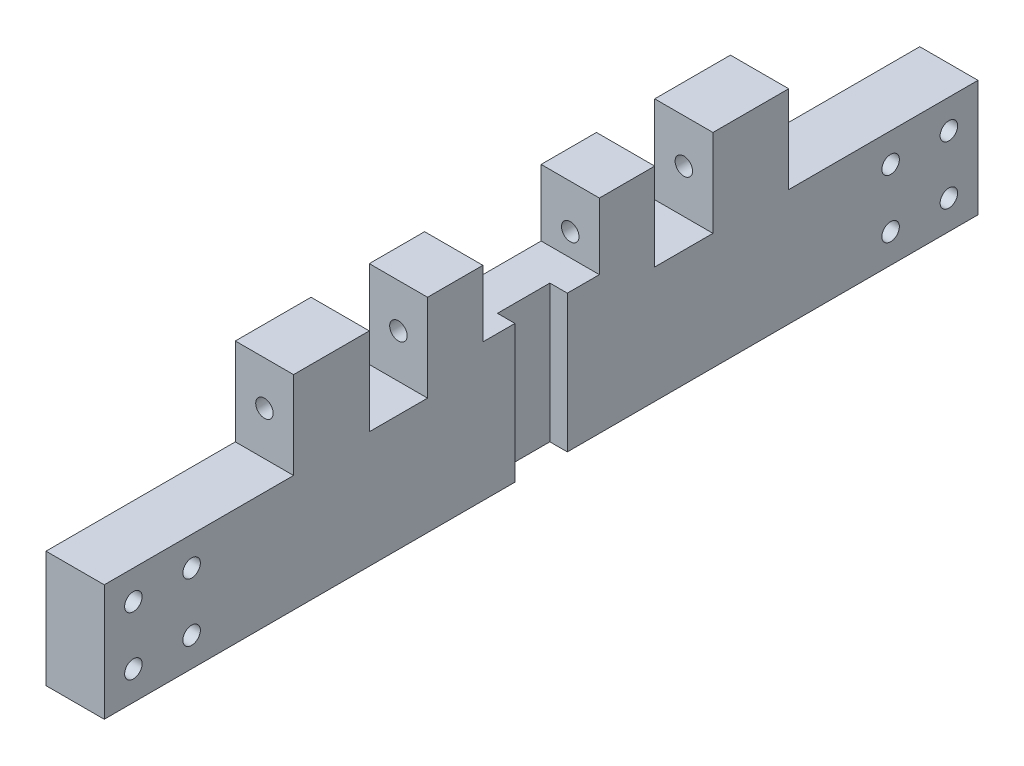
ISO-10303-21;
HEADER;
FILE_DESCRIPTION(('STEP AP214'),'2;1');
FILE_NAME('part.step','',(''),(''),'','','');
FILE_SCHEMA(('AUTOMOTIVE_DESIGN { 1 0 10303 214 1 1 1 1 }'));
ENDSEC;
DATA;
#1=APPLICATION_CONTEXT('core data for automotive mechanical design processes');
#2=APPLICATION_PROTOCOL_DEFINITION('international standard','automotive_design',2000,#1);
#3=PRODUCT_CONTEXT('',#1,'mechanical');
#4=PRODUCT('Part','Part','',(#3));
#5=PRODUCT_RELATED_PRODUCT_CATEGORY('part','',(#4));
#6=PRODUCT_DEFINITION_FORMATION('','',#4);
#7=PRODUCT_DEFINITION_CONTEXT('part definition',#1,'design');
#8=PRODUCT_DEFINITION('design','',#6,#7);
#9=PRODUCT_DEFINITION_SHAPE('','',#8);
#10=(LENGTH_UNIT() NAMED_UNIT(*) SI_UNIT(.MILLI.,.METRE.));
#11=(NAMED_UNIT(*) PLANE_ANGLE_UNIT() SI_UNIT($,.RADIAN.));
#12=(NAMED_UNIT(*) SI_UNIT($,.STERADIAN.) SOLID_ANGLE_UNIT());
#13=UNCERTAINTY_MEASURE_WITH_UNIT(LENGTH_MEASURE(1.E-05),#10,'distance_accuracy_value','');
#14=(GEOMETRIC_REPRESENTATION_CONTEXT(3) GLOBAL_UNCERTAINTY_ASSIGNED_CONTEXT((#13)) GLOBAL_UNIT_ASSIGNED_CONTEXT((#10,
#11,#12)) REPRESENTATION_CONTEXT('',''));
#15=CARTESIAN_POINT('',(0.,0.,0.));
#16=DIRECTION('',(0.,0.,1.));
#17=DIRECTION('',(1.,0.,0.));
#18=AXIS2_PLACEMENT_3D('',#15,#16,#17);
#19=CARTESIAN_POINT('',(10.,0.,0.));
#20=DIRECTION('',(-1.,0.,0.));
#21=DIRECTION('',(0.,0.,1.));
#22=AXIS2_PLACEMENT_3D('',#19,#20,#21);
#23=PLANE('',#22);
#24=CARTESIAN_POINT('',(10.,6.38988451935527,-60.));
#25=DIRECTION('',(-1.,0.,0.));
#26=DIRECTION('',(0.,0.,1.));
#27=AXIS2_PLACEMENT_3D('',#24,#25,#26);
#28=CIRCLE('',#27,1.5);
#29=CARTESIAN_POINT('',(10.,6.38988451935527,-58.5));
#30=VERTEX_POINT('',#29);
#31=EDGE_CURVE('E247',#30,#30,#28,.T.);
#32=ORIENTED_EDGE('',*,*,#31,.T.);
#33=EDGE_LOOP('',(#32));
#34=FACE_BOUND('',#33,.T.);
#35=CARTESIAN_POINT('',(10.,-3.61011548064473,-70.));
#36=DIRECTION('',(-1.,0.,0.));
#37=DIRECTION('',(0.,0.,1.));
#38=AXIS2_PLACEMENT_3D('',#35,#36,#37);
#39=CIRCLE('',#38,1.5);
#40=CARTESIAN_POINT('',(10.,-3.61011548064473,-68.5));
#41=VERTEX_POINT('',#40);
#42=EDGE_CURVE('E240',#41,#41,#39,.T.);
#43=ORIENTED_EDGE('',*,*,#42,.T.);
#44=EDGE_LOOP('',(#43));
#45=FACE_BOUND('',#44,.T.);
#46=CARTESIAN_POINT('',(10.,-3.61011548064473,-60.));
#47=DIRECTION('',(-1.,0.,0.));
#48=DIRECTION('',(0.,0.,1.));
#49=AXIS2_PLACEMENT_3D('',#46,#47,#48);
#50=CIRCLE('',#49,1.5);
#51=CARTESIAN_POINT('',(10.,-3.61011548064473,-58.5));
#52=VERTEX_POINT('',#51);
#53=EDGE_CURVE('E232',#52,#52,#50,.T.);
#54=ORIENTED_EDGE('',*,*,#53,.T.);
#55=EDGE_LOOP('',(#54));
#56=FACE_BOUND('',#55,.T.);
#57=CARTESIAN_POINT('',(10.,6.38988451935527,-70.));
#58=DIRECTION('',(-1.,0.,0.));
#59=DIRECTION('',(0.,0.,1.));
#60=AXIS2_PLACEMENT_3D('',#57,#58,#59);
#61=CIRCLE('',#60,1.5);
#62=CARTESIAN_POINT('',(10.,6.38988451935527,-68.5));
#63=VERTEX_POINT('',#62);
#64=EDGE_CURVE('E246',#63,#63,#61,.T.);
#65=ORIENTED_EDGE('',*,*,#64,.T.);
#66=EDGE_LOOP('',(#65));
#67=FACE_BOUND('',#66,.T.);
#68=DIRECTION('',(0.,1.,0.));
#69=VECTOR('',#68,1.);
#70=CARTESIAN_POINT('',(10.,15.,-4.5));
#71=LINE('',#70,#69);
#72=CARTESIAN_POINT('',(10.,-8.61011548064473,-4.5));
#73=VERTEX_POINT('',#72);
#74=CARTESIAN_POINT('',(10.,15.,-4.5));
#75=VERTEX_POINT('',#74);
#76=EDGE_CURVE('E223',#73,#75,#71,.T.);
#77=ORIENTED_EDGE('',*,*,#76,.F.);
#78=DIRECTION('',(0.,0.,1.));
#79=VECTOR('',#78,1.);
#80=CARTESIAN_POINT('',(10.,-8.61011548064473,-75.));
#81=LINE('',#80,#79);
#82=CARTESIAN_POINT('',(10.,-8.61011548064473,-75.));
#83=VERTEX_POINT('',#82);
#84=EDGE_CURVE('E309',#83,#73,#81,.T.);
#85=ORIENTED_EDGE('',*,*,#84,.F.);
#86=DIRECTION('',(0.,-1.,0.));
#87=VECTOR('',#86,1.);
#88=CARTESIAN_POINT('',(10.,11.3898845193553,-75.));
#89=LINE('',#88,#87);
#90=CARTESIAN_POINT('',(10.,11.3898845193553,-75.));
#91=VERTEX_POINT('',#90);
#92=EDGE_CURVE('E303',#91,#83,#89,.T.);
#93=ORIENTED_EDGE('',*,*,#92,.F.);
#94=DIRECTION('',(0.,0.,1.));
#95=VECTOR('',#94,1.);
#96=CARTESIAN_POINT('',(10.,11.3898845193553,-75.));
#97=LINE('',#96,#95);
#98=CARTESIAN_POINT('',(10.,11.3898845193553,-42.5));
#99=VERTEX_POINT('',#98);
#100=EDGE_CURVE('E312',#91,#99,#97,.T.);
#101=ORIENTED_EDGE('',*,*,#100,.T.);
#102=DIRECTION('',(0.,1.,0.));
#103=VECTOR('',#102,1.);
#104=CARTESIAN_POINT('',(10.,0.,-42.5));
#105=LINE('',#104,#103);
#106=CARTESIAN_POINT('',(10.,26.3898845193553,-42.5));
#107=VERTEX_POINT('',#106);
#108=EDGE_CURVE('E427',#99,#107,#105,.T.);
#109=ORIENTED_EDGE('',*,*,#108,.T.);
#110=DIRECTION('',(0.,0.,1.));
#111=VECTOR('',#110,1.);
#112=CARTESIAN_POINT('',(10.,26.3898845193553,0.));
#113=LINE('',#112,#111);
#114=CARTESIAN_POINT('',(10.,26.3898845193553,-29.5));
#115=VERTEX_POINT('',#114);
#116=EDGE_CURVE('E421',#107,#115,#113,.T.);
#117=ORIENTED_EDGE('',*,*,#116,.T.);
#118=DIRECTION('',(0.,-1.,0.));
#119=VECTOR('',#118,1.);
#120=CARTESIAN_POINT('',(10.,0.,-29.5));
#121=LINE('',#120,#119);
#122=CARTESIAN_POINT('',(10.,11.3898845193553,-29.5));
#123=VERTEX_POINT('',#122);
#124=EDGE_CURVE('E431',#115,#123,#121,.T.);
#125=ORIENTED_EDGE('',*,*,#124,.T.);
#126=CARTESIAN_POINT('',(10.,11.3898845193553,-19.5));
#127=VERTEX_POINT('',#126);
#128=EDGE_CURVE('E311',#123,#127,#97,.T.);
#129=ORIENTED_EDGE('',*,*,#128,.T.);
#130=DIRECTION('',(0.,1.,0.));
#131=VECTOR('',#130,1.);
#132=CARTESIAN_POINT('',(10.,0.,-19.5));
#133=LINE('',#132,#131);
#134=CARTESIAN_POINT('',(10.,26.3898845193553,-19.5));
#135=VERTEX_POINT('',#134);
#136=EDGE_CURVE('E410',#127,#135,#133,.T.);
#137=ORIENTED_EDGE('',*,*,#136,.T.);
#138=DIRECTION('',(0.,0.,-1.));
#139=VECTOR('',#138,1.);
#140=CARTESIAN_POINT('',(10.,26.3898845193553,0.));
#141=LINE('',#140,#139);
#142=CARTESIAN_POINT('',(10.,26.3898845193553,-10.));
#143=VERTEX_POINT('',#142);
#144=EDGE_CURVE('E405',#143,#135,#141,.T.);
#145=ORIENTED_EDGE('',*,*,#144,.F.);
#146=DIRECTION('',(0.,1.,0.));
#147=VECTOR('',#146,1.);
#148=CARTESIAN_POINT('',(10.,0.,-10.));
#149=LINE('',#148,#147);
#150=CARTESIAN_POINT('',(10.,15.,-10.));
#151=VERTEX_POINT('',#150);
#152=EDGE_CURVE('E404',#151,#143,#149,.T.);
#153=ORIENTED_EDGE('',*,*,#152,.F.);
#154=DIRECTION('',(0.,0.,1.));
#155=VECTOR('',#154,1.);
#156=CARTESIAN_POINT('',(10.,15.,10.));
#157=LINE('',#156,#155);
#158=EDGE_CURVE('E320',#151,#75,#157,.T.);
#159=ORIENTED_EDGE('',*,*,#158,.T.);
#160=EDGE_LOOP('',(#77,#85,#93,#101,#109,#117,#125,#129,#137,#145,#153,#159));
#161=FACE_BOUND('',#160,.T.);
#162=ADVANCED_FACE('F39',(#34,#45,#56,#67,#161),#23,.F.);
#163=CARTESIAN_POINT('',(10.,6.38988451935527,70.));
#164=DIRECTION('',(1.,0.,0.));
#165=DIRECTION('',(0.,0.,-1.));
#166=AXIS2_PLACEMENT_3D('',#163,#164,#165);
#167=CIRCLE('',#166,1.5);
#168=CARTESIAN_POINT('',(10.,6.38988451935527,68.5));
#169=VERTEX_POINT('',#168);
#170=EDGE_CURVE('E270',#169,#169,#167,.T.);
#171=ORIENTED_EDGE('',*,*,#170,.F.);
#172=EDGE_LOOP('',(#171));
#173=FACE_BOUND('',#172,.T.);
#174=CARTESIAN_POINT('',(10.,-3.61011548064473,60.));
#175=DIRECTION('',(1.,0.,0.));
#176=DIRECTION('',(0.,0.,-1.));
#177=AXIS2_PLACEMENT_3D('',#174,#175,#176);
#178=CIRCLE('',#177,1.5);
#179=CARTESIAN_POINT('',(10.,-3.61011548064473,58.5));
#180=VERTEX_POINT('',#179);
#181=EDGE_CURVE('E258',#180,#180,#178,.T.);
#182=ORIENTED_EDGE('',*,*,#181,.F.);
#183=EDGE_LOOP('',(#182));
#184=FACE_BOUND('',#183,.T.);
#185=CARTESIAN_POINT('',(10.,-3.61011548064473,70.));
#186=DIRECTION('',(1.,0.,0.));
#187=DIRECTION('',(0.,0.,-1.));
#188=AXIS2_PLACEMENT_3D('',#185,#186,#187);
#189=CIRCLE('',#188,1.5);
#190=CARTESIAN_POINT('',(10.,-3.61011548064473,68.5));
#191=VERTEX_POINT('',#190);
#192=EDGE_CURVE('E264',#191,#191,#189,.T.);
#193=ORIENTED_EDGE('',*,*,#192,.F.);
#194=EDGE_LOOP('',(#193));
#195=FACE_BOUND('',#194,.T.);
#196=CARTESIAN_POINT('',(10.,6.38988451935527,60.));
#197=DIRECTION('',(1.,0.,0.));
#198=DIRECTION('',(0.,0.,-1.));
#199=AXIS2_PLACEMENT_3D('',#196,#197,#198);
#200=CIRCLE('',#199,1.5);
#201=CARTESIAN_POINT('',(10.,6.38988451935527,58.5));
#202=VERTEX_POINT('',#201);
#203=EDGE_CURVE('E271',#202,#202,#200,.T.);
#204=ORIENTED_EDGE('',*,*,#203,.F.);
#205=EDGE_LOOP('',(#204));
#206=FACE_BOUND('',#205,.T.);
#207=DIRECTION('',(0.,0.,-1.));
#208=VECTOR('',#207,1.);
#209=CARTESIAN_POINT('',(10.,-8.61011548064473,75.));
#210=LINE('',#209,#208);
#211=CARTESIAN_POINT('',(10.,-8.61011548064473,75.));
#212=VERTEX_POINT('',#211);
#213=CARTESIAN_POINT('',(10.,-8.61011548064473,4.5));
#214=VERTEX_POINT('',#213);
#215=EDGE_CURVE('E200',#212,#214,#210,.T.);
#216=ORIENTED_EDGE('',*,*,#215,.T.);
#217=DIRECTION('',(0.,-1.,0.));
#218=VECTOR('',#217,1.);
#219=CARTESIAN_POINT('',(10.,15.,4.5));
#220=LINE('',#219,#218);
#221=CARTESIAN_POINT('',(10.,15.,4.5));
#222=VERTEX_POINT('',#221);
#223=EDGE_CURVE('E204',#222,#214,#220,.T.);
#224=ORIENTED_EDGE('',*,*,#223,.F.);
#225=CARTESIAN_POINT('',(10.,15.,10.));
#226=VERTEX_POINT('',#225);
#227=EDGE_CURVE('E324',#222,#226,#157,.T.);
#228=ORIENTED_EDGE('',*,*,#227,.T.);
#229=DIRECTION('',(0.,1.,0.));
#230=VECTOR('',#229,1.);
#231=CARTESIAN_POINT('',(10.,0.,10.));
#232=LINE('',#231,#230);
#233=CARTESIAN_POINT('',(10.,26.3898845193553,10.));
#234=VERTEX_POINT('',#233);
#235=EDGE_CURVE('E361',#226,#234,#232,.T.);
#236=ORIENTED_EDGE('',*,*,#235,.T.);
#237=DIRECTION('',(0.,0.,1.));
#238=VECTOR('',#237,1.);
#239=CARTESIAN_POINT('',(10.,26.3898845193553,0.));
#240=LINE('',#239,#238);
#241=CARTESIAN_POINT('',(10.,26.3898845193553,19.5));
#242=VERTEX_POINT('',#241);
#243=EDGE_CURVE('E357',#234,#242,#240,.T.);
#244=ORIENTED_EDGE('',*,*,#243,.T.);
#245=DIRECTION('',(0.,1.,0.));
#246=VECTOR('',#245,1.);
#247=CARTESIAN_POINT('',(10.,0.,19.5));
#248=LINE('',#247,#246);
#249=CARTESIAN_POINT('',(10.,11.3898845193553,19.5));
#250=VERTEX_POINT('',#249);
#251=EDGE_CURVE('E352',#250,#242,#248,.T.);
#252=ORIENTED_EDGE('',*,*,#251,.F.);
#253=DIRECTION('',(0.,0.,-1.));
#254=VECTOR('',#253,1.);
#255=CARTESIAN_POINT('',(10.,11.3898845193553,75.));
#256=LINE('',#255,#254);
#257=CARTESIAN_POINT('',(10.,11.3898845193553,29.5));
#258=VERTEX_POINT('',#257);
#259=EDGE_CURVE('E61',#258,#250,#256,.T.);
#260=ORIENTED_EDGE('',*,*,#259,.F.);
#261=DIRECTION('',(0.,-1.,0.));
#262=VECTOR('',#261,1.);
#263=CARTESIAN_POINT('',(10.,0.,29.5));
#264=LINE('',#263,#262);
#265=CARTESIAN_POINT('',(10.,26.3898845193553,29.5));
#266=VERTEX_POINT('',#265);
#267=EDGE_CURVE('E374',#266,#258,#264,.T.);
#268=ORIENTED_EDGE('',*,*,#267,.F.);
#269=DIRECTION('',(0.,0.,-1.));
#270=VECTOR('',#269,1.);
#271=CARTESIAN_POINT('',(10.,26.3898845193553,0.));
#272=LINE('',#271,#270);
#273=CARTESIAN_POINT('',(10.,26.3898845193553,42.5));
#274=VERTEX_POINT('',#273);
#275=EDGE_CURVE('E383',#274,#266,#272,.T.);
#276=ORIENTED_EDGE('',*,*,#275,.F.);
#277=DIRECTION('',(0.,1.,0.));
#278=VECTOR('',#277,1.);
#279=CARTESIAN_POINT('',(10.,0.,42.5));
#280=LINE('',#279,#278);
#281=CARTESIAN_POINT('',(10.,11.3898845193553,42.5));
#282=VERTEX_POINT('',#281);
#283=EDGE_CURVE('E378',#282,#274,#280,.T.);
#284=ORIENTED_EDGE('',*,*,#283,.F.);
#285=CARTESIAN_POINT('',(10.,11.3898845193553,75.));
#286=VERTEX_POINT('',#285);
#287=EDGE_CURVE('E211',#286,#282,#256,.T.);
#288=ORIENTED_EDGE('',*,*,#287,.F.);
#289=DIRECTION('',(0.,-1.,0.));
#290=VECTOR('',#289,1.);
#291=CARTESIAN_POINT('',(10.,11.3898845193553,75.));
#292=LINE('',#291,#290);
#293=EDGE_CURVE('E207',#286,#212,#292,.T.);
#294=ORIENTED_EDGE('',*,*,#293,.T.);
#295=EDGE_LOOP('',(#216,#224,#228,#236,#244,#252,#260,#268,#276,#284,#288,#294));
#296=FACE_BOUND('',#295,.T.);
#297=ADVANCED_FACE('F202',(#173,#184,#195,#206,#296),#23,.F.);
#298=CARTESIAN_POINT('',(0.,0.,0.));
#299=DIRECTION('',(-1.,0.,0.));
#300=DIRECTION('',(0.,0.,1.));
#301=AXIS2_PLACEMENT_3D('',#298,#299,#300);
#302=PLANE('',#301);
#303=CARTESIAN_POINT('',(0.,6.38988451935527,-60.));
#304=DIRECTION('',(-1.,0.,0.));
#305=DIRECTION('',(0.,0.,1.));
#306=AXIS2_PLACEMENT_3D('',#303,#304,#305);
#307=CIRCLE('',#306,1.5);
#308=CARTESIAN_POINT('',(0.,6.38988451935527,-58.5));
#309=VERTEX_POINT('',#308);
#310=EDGE_CURVE('E243',#309,#309,#307,.T.);
#311=ORIENTED_EDGE('',*,*,#310,.F.);
#312=EDGE_LOOP('',(#311));
#313=FACE_BOUND('',#312,.T.);
#314=CARTESIAN_POINT('',(0.,-3.61011548064473,-70.));
#315=DIRECTION('',(-1.,0.,0.));
#316=DIRECTION('',(0.,0.,1.));
#317=AXIS2_PLACEMENT_3D('',#314,#315,#316);
#318=CIRCLE('',#317,1.5);
#319=CARTESIAN_POINT('',(0.,-3.61011548064473,-68.5));
#320=VERTEX_POINT('',#319);
#321=EDGE_CURVE('E250',#320,#320,#318,.T.);
#322=ORIENTED_EDGE('',*,*,#321,.F.);
#323=EDGE_LOOP('',(#322));
#324=FACE_BOUND('',#323,.T.);
#325=CARTESIAN_POINT('',(0.,-3.61011548064473,-60.));
#326=DIRECTION('',(-1.,0.,0.));
#327=DIRECTION('',(0.,0.,1.));
#328=AXIS2_PLACEMENT_3D('',#325,#326,#327);
#329=CIRCLE('',#328,1.5);
#330=CARTESIAN_POINT('',(0.,-3.61011548064473,-58.5));
#331=VERTEX_POINT('',#330);
#332=EDGE_CURVE('E237',#331,#331,#329,.T.);
#333=ORIENTED_EDGE('',*,*,#332,.F.);
#334=EDGE_LOOP('',(#333));
#335=FACE_BOUND('',#334,.T.);
#336=CARTESIAN_POINT('',(0.,6.38988451935527,-70.));
#337=DIRECTION('',(-1.,0.,0.));
#338=DIRECTION('',(0.,0.,1.));
#339=AXIS2_PLACEMENT_3D('',#336,#337,#338);
#340=CIRCLE('',#339,1.5);
#341=CARTESIAN_POINT('',(0.,6.38988451935527,-68.5));
#342=VERTEX_POINT('',#341);
#343=EDGE_CURVE('E255',#342,#342,#340,.T.);
#344=ORIENTED_EDGE('',*,*,#343,.F.);
#345=EDGE_LOOP('',(#344));
#346=FACE_BOUND('',#345,.T.);
#347=CARTESIAN_POINT('',(0.,6.38988451935527,60.));
#348=DIRECTION('',(1.,0.,0.));
#349=DIRECTION('',(0.,0.,-1.));
#350=AXIS2_PLACEMENT_3D('',#347,#348,#349);
#351=CIRCLE('',#350,1.5);
#352=CARTESIAN_POINT('',(0.,6.38988451935527,58.5));
#353=VERTEX_POINT('',#352);
#354=EDGE_CURVE('E267',#353,#353,#351,.T.);
#355=ORIENTED_EDGE('',*,*,#354,.T.);
#356=EDGE_LOOP('',(#355));
#357=FACE_BOUND('',#356,.T.);
#358=CARTESIAN_POINT('',(0.,-3.61011548064473,70.));
#359=DIRECTION('',(1.,0.,0.));
#360=DIRECTION('',(0.,0.,-1.));
#361=AXIS2_PLACEMENT_3D('',#358,#359,#360);
#362=CIRCLE('',#361,1.5);
#363=CARTESIAN_POINT('',(0.,-3.61011548064473,68.5));
#364=VERTEX_POINT('',#363);
#365=EDGE_CURVE('E274',#364,#364,#362,.T.);
#366=ORIENTED_EDGE('',*,*,#365,.T.);
#367=EDGE_LOOP('',(#366));
#368=FACE_BOUND('',#367,.T.);
#369=CARTESIAN_POINT('',(0.,-3.61011548064473,60.));
#370=DIRECTION('',(1.,0.,0.));
#371=DIRECTION('',(0.,0.,-1.));
#372=AXIS2_PLACEMENT_3D('',#369,#370,#371);
#373=CIRCLE('',#372,1.5);
#374=CARTESIAN_POINT('',(0.,-3.61011548064473,58.5));
#375=VERTEX_POINT('',#374);
#376=EDGE_CURVE('E261',#375,#375,#373,.T.);
#377=ORIENTED_EDGE('',*,*,#376,.T.);
#378=EDGE_LOOP('',(#377));
#379=FACE_BOUND('',#378,.T.);
#380=CARTESIAN_POINT('',(0.,6.38988451935527,70.));
#381=DIRECTION('',(1.,0.,0.));
#382=DIRECTION('',(0.,0.,-1.));
#383=AXIS2_PLACEMENT_3D('',#380,#381,#382);
#384=CIRCLE('',#383,1.5);
#385=CARTESIAN_POINT('',(0.,6.38988451935527,68.5));
#386=VERTEX_POINT('',#385);
#387=EDGE_CURVE('E279',#386,#386,#384,.T.);
#388=ORIENTED_EDGE('',*,*,#387,.T.);
#389=EDGE_LOOP('',(#388));
#390=FACE_BOUND('',#389,.T.);
#391=DIRECTION('',(0.,0.,1.));
#392=VECTOR('',#391,1.);
#393=CARTESIAN_POINT('',(0.,-8.61011548064473,-75.));
#394=LINE('',#393,#392);
#395=CARTESIAN_POINT('',(0.,-8.61011548064473,-75.));
#396=VERTEX_POINT('',#395);
#397=CARTESIAN_POINT('',(0.,-8.61011548064473,75.));
#398=VERTEX_POINT('',#397);
#399=EDGE_CURVE('E307',#396,#398,#394,.T.);
#400=ORIENTED_EDGE('',*,*,#399,.T.);
#401=DIRECTION('',(0.,1.,0.));
#402=VECTOR('',#401,1.);
#403=CARTESIAN_POINT('',(0.,11.3898845193553,75.));
#404=LINE('',#403,#402);
#405=CARTESIAN_POINT('',(0.,11.3898845193553,75.));
#406=VERTEX_POINT('',#405);
#407=EDGE_CURVE('E282',#398,#406,#404,.T.);
#408=ORIENTED_EDGE('',*,*,#407,.T.);
#409=DIRECTION('',(0.,0.,-1.));
#410=VECTOR('',#409,1.);
#411=CARTESIAN_POINT('',(0.,11.3898845193553,75.));
#412=LINE('',#411,#410);
#413=CARTESIAN_POINT('',(0.,11.3898845193553,42.5));
#414=VERTEX_POINT('',#413);
#415=EDGE_CURVE('E294',#406,#414,#412,.T.);
#416=ORIENTED_EDGE('',*,*,#415,.T.);
#417=DIRECTION('',(0.,1.,0.));
#418=VECTOR('',#417,1.);
#419=CARTESIAN_POINT('',(0.,0.,42.5));
#420=LINE('',#419,#418);
#421=CARTESIAN_POINT('',(0.,26.3898845193553,42.5));
#422=VERTEX_POINT('',#421);
#423=EDGE_CURVE('E381',#414,#422,#420,.T.);
#424=ORIENTED_EDGE('',*,*,#423,.T.);
#425=DIRECTION('',(0.,0.,-1.));
#426=VECTOR('',#425,1.);
#427=CARTESIAN_POINT('',(0.,26.3898845193553,0.));
#428=LINE('',#427,#426);
#429=CARTESIAN_POINT('',(0.,26.3898845193553,29.5));
#430=VERTEX_POINT('',#429);
#431=EDGE_CURVE('E388',#422,#430,#428,.T.);
#432=ORIENTED_EDGE('',*,*,#431,.T.);
#433=DIRECTION('',(0.,-1.,0.));
#434=VECTOR('',#433,1.);
#435=CARTESIAN_POINT('',(0.,0.,29.5));
#436=LINE('',#435,#434);
#437=CARTESIAN_POINT('',(0.,11.3898845193553,29.5));
#438=VERTEX_POINT('',#437);
#439=EDGE_CURVE('E386',#430,#438,#436,.T.);
#440=ORIENTED_EDGE('',*,*,#439,.T.);
#441=CARTESIAN_POINT('',(0.,11.3898845193553,19.5));
#442=VERTEX_POINT('',#441);
#443=EDGE_CURVE('E293',#438,#442,#412,.T.);
#444=ORIENTED_EDGE('',*,*,#443,.T.);
#445=DIRECTION('',(0.,1.,0.));
#446=VECTOR('',#445,1.);
#447=CARTESIAN_POINT('',(0.,0.,19.5));
#448=LINE('',#447,#446);
#449=CARTESIAN_POINT('',(0.,26.3898845193553,19.5));
#450=VERTEX_POINT('',#449);
#451=EDGE_CURVE('E351',#442,#450,#448,.T.);
#452=ORIENTED_EDGE('',*,*,#451,.T.);
#453=DIRECTION('',(0.,0.,1.));
#454=VECTOR('',#453,1.);
#455=CARTESIAN_POINT('',(0.,26.3898845193553,0.));
#456=LINE('',#455,#454);
#457=CARTESIAN_POINT('',(0.,26.3898845193553,10.));
#458=VERTEX_POINT('',#457);
#459=EDGE_CURVE('E360',#458,#450,#456,.T.);
#460=ORIENTED_EDGE('',*,*,#459,.F.);
#461=DIRECTION('',(0.,1.,0.));
#462=VECTOR('',#461,1.);
#463=CARTESIAN_POINT('',(0.,0.,10.));
#464=LINE('',#463,#462);
#465=CARTESIAN_POINT('',(0.,15.,10.));
#466=VERTEX_POINT('',#465);
#467=EDGE_CURVE('E355',#466,#458,#464,.T.);
#468=ORIENTED_EDGE('',*,*,#467,.F.);
#469=DIRECTION('',(0.,0.,1.));
#470=VECTOR('',#469,1.);
#471=CARTESIAN_POINT('',(0.,15.,10.));
#472=LINE('',#471,#470);
#473=CARTESIAN_POINT('',(0.,15.,-10.));
#474=VERTEX_POINT('',#473);
#475=EDGE_CURVE('E319',#474,#466,#472,.T.);
#476=ORIENTED_EDGE('',*,*,#475,.F.);
#477=DIRECTION('',(0.,1.,0.));
#478=VECTOR('',#477,1.);
#479=CARTESIAN_POINT('',(0.,0.,-10.));
#480=LINE('',#479,#478);
#481=CARTESIAN_POINT('',(0.,26.3898845193553,-10.));
#482=VERTEX_POINT('',#481);
#483=EDGE_CURVE('E413',#474,#482,#480,.T.);
#484=ORIENTED_EDGE('',*,*,#483,.T.);
#485=DIRECTION('',(0.,0.,-1.));
#486=VECTOR('',#485,1.);
#487=CARTESIAN_POINT('',(0.,26.3898845193553,0.));
#488=LINE('',#487,#486);
#489=CARTESIAN_POINT('',(0.,26.3898845193553,-19.5));
#490=VERTEX_POINT('',#489);
#491=EDGE_CURVE('E418',#482,#490,#488,.T.);
#492=ORIENTED_EDGE('',*,*,#491,.T.);
#493=DIRECTION('',(0.,1.,0.));
#494=VECTOR('',#493,1.);
#495=CARTESIAN_POINT('',(0.,0.,-19.5));
#496=LINE('',#495,#494);
#497=CARTESIAN_POINT('',(0.,11.3898845193553,-19.5));
#498=VERTEX_POINT('',#497);
#499=EDGE_CURVE('E408',#498,#490,#496,.T.);
#500=ORIENTED_EDGE('',*,*,#499,.F.);
#501=DIRECTION('',(0.,0.,1.));
#502=VECTOR('',#501,1.);
#503=CARTESIAN_POINT('',(0.,11.3898845193553,-75.));
#504=LINE('',#503,#502);
#505=CARTESIAN_POINT('',(0.,11.3898845193553,-29.5));
#506=VERTEX_POINT('',#505);
#507=EDGE_CURVE('E315',#506,#498,#504,.T.);
#508=ORIENTED_EDGE('',*,*,#507,.F.);
#509=DIRECTION('',(0.,-1.,0.));
#510=VECTOR('',#509,1.);
#511=CARTESIAN_POINT('',(0.,0.,-29.5));
#512=LINE('',#511,#510);
#513=CARTESIAN_POINT('',(0.,26.3898845193553,-29.5));
#514=VERTEX_POINT('',#513);
#515=EDGE_CURVE('E430',#514,#506,#512,.T.);
#516=ORIENTED_EDGE('',*,*,#515,.F.);
#517=DIRECTION('',(0.,0.,1.));
#518=VECTOR('',#517,1.);
#519=CARTESIAN_POINT('',(0.,26.3898845193553,0.));
#520=LINE('',#519,#518);
#521=CARTESIAN_POINT('',(0.,26.3898845193553,-42.5));
#522=VERTEX_POINT('',#521);
#523=EDGE_CURVE('E438',#522,#514,#520,.T.);
#524=ORIENTED_EDGE('',*,*,#523,.F.);
#525=DIRECTION('',(0.,1.,0.));
#526=VECTOR('',#525,1.);
#527=CARTESIAN_POINT('',(0.,0.,-42.5));
#528=LINE('',#527,#526);
#529=CARTESIAN_POINT('',(0.,11.3898845193553,-42.5));
#530=VERTEX_POINT('',#529);
#531=EDGE_CURVE('E442',#530,#522,#528,.T.);
#532=ORIENTED_EDGE('',*,*,#531,.F.);
#533=CARTESIAN_POINT('',(0.,11.3898845193553,-75.));
#534=VERTEX_POINT('',#533);
#535=EDGE_CURVE('E316',#534,#530,#504,.T.);
#536=ORIENTED_EDGE('',*,*,#535,.F.);
#537=DIRECTION('',(0.,1.,0.));
#538=VECTOR('',#537,1.);
#539=CARTESIAN_POINT('',(0.,11.3898845193553,-75.));
#540=LINE('',#539,#538);
#541=EDGE_CURVE('E210',#396,#534,#540,.T.);
#542=ORIENTED_EDGE('',*,*,#541,.F.);
#543=EDGE_LOOP('',(#400,#408,#416,#424,#432,#440,#444,#452,#460,#468,#476,#484,#492,#500,#508,
#516,#524,#532,#536,#542));
#544=FACE_BOUND('',#543,.T.);
#545=ADVANCED_FACE('F496',(#313,#324,#335,#346,#357,#368,#379,#390,#544),#302,.T.);
#546=CARTESIAN_POINT('',(7.,15.,-4.5));
#547=DIRECTION('',(0.,0.,-1.));
#548=DIRECTION('',(0.,1.,0.));
#549=AXIS2_PLACEMENT_3D('',#546,#547,#548);
#550=PLANE('',#549);
#551=DIRECTION('',(-1.,0.,0.));
#552=VECTOR('',#551,1.);
#553=CARTESIAN_POINT('',(6.99999999999999,-8.61011548064474,-4.5));
#554=LINE('',#553,#552);
#555=CARTESIAN_POINT('',(7.,-8.61011548064473,-4.5));
#556=VERTEX_POINT('',#555);
#557=EDGE_CURVE('E54',#73,#556,#554,.T.);
#558=ORIENTED_EDGE('',*,*,#557,.F.);
#559=ORIENTED_EDGE('',*,*,#76,.T.);
#560=DIRECTION('',(1.,0.,0.));
#561=VECTOR('',#560,1.);
#562=CARTESIAN_POINT('',(7.,15.,-4.5));
#563=LINE('',#562,#561);
#564=CARTESIAN_POINT('',(7.,15.,-4.5));
#565=VERTEX_POINT('',#564);
#566=EDGE_CURVE('E233',#565,#75,#563,.T.);
#567=ORIENTED_EDGE('',*,*,#566,.F.);
#568=DIRECTION('',(0.,1.,0.));
#569=VECTOR('',#568,1.);
#570=CARTESIAN_POINT('',(7.,15.,-4.5));
#571=LINE('',#570,#569);
#572=EDGE_CURVE('E222',#556,#565,#571,.T.);
#573=ORIENTED_EDGE('',*,*,#572,.F.);
#574=EDGE_LOOP('',(#558,#559,#567,#573));
#575=FACE_BOUND('',#574,.T.);
#576=ADVANCED_FACE('F505',(#575),#550,.F.);
#577=CARTESIAN_POINT('',(7.,15.,4.5));
#578=DIRECTION('',(0.,0.,1.));
#579=DIRECTION('',(1.,0.,0.));
#580=AXIS2_PLACEMENT_3D('',#577,#578,#579);
#581=PLANE('',#580);
#582=DIRECTION('',(1.,0.,0.));
#583=VECTOR('',#582,1.);
#584=CARTESIAN_POINT('',(6.99999999999999,-8.61011548064474,4.5));
#585=LINE('',#584,#583);
#586=CARTESIAN_POINT('',(7.,-8.61011548064473,4.5));
#587=VERTEX_POINT('',#586);
#588=EDGE_CURVE('E214',#587,#214,#585,.T.);
#589=ORIENTED_EDGE('',*,*,#588,.F.);
#590=DIRECTION('',(0.,-1.,0.));
#591=VECTOR('',#590,1.);
#592=CARTESIAN_POINT('',(7.,15.,4.5));
#593=LINE('',#592,#591);
#594=CARTESIAN_POINT('',(7.,15.,4.5));
#595=VERTEX_POINT('',#594);
#596=EDGE_CURVE('E236',#595,#587,#593,.T.);
#597=ORIENTED_EDGE('',*,*,#596,.F.);
#598=DIRECTION('',(1.,0.,0.));
#599=VECTOR('',#598,1.);
#600=CARTESIAN_POINT('',(7.,15.,4.5));
#601=LINE('',#600,#599);
#602=EDGE_CURVE('E221',#595,#222,#601,.T.);
#603=ORIENTED_EDGE('',*,*,#602,.T.);
#604=ORIENTED_EDGE('',*,*,#223,.T.);
#605=EDGE_LOOP('',(#589,#597,#603,#604));
#606=FACE_BOUND('',#605,.T.);
#607=ADVANCED_FACE('F219',(#606),#581,.F.);
#608=CARTESIAN_POINT('',(7.,0.,0.));
#609=DIRECTION('',(1.,0.,0.));
#610=DIRECTION('',(0.,0.,-1.));
#611=AXIS2_PLACEMENT_3D('',#608,#609,#610);
#612=PLANE('',#611);
#613=ORIENTED_EDGE('',*,*,#596,.T.);
#614=DIRECTION('',(0.,0.,-1.));
#615=VECTOR('',#614,1.);
#616=CARTESIAN_POINT('',(7.,-8.61011548064473,0.));
#617=LINE('',#616,#615);
#618=EDGE_CURVE('E11',#587,#556,#617,.T.);
#619=ORIENTED_EDGE('',*,*,#618,.T.);
#620=ORIENTED_EDGE('',*,*,#572,.T.);
#621=DIRECTION('',(0.,0.,1.));
#622=VECTOR('',#621,1.);
#623=CARTESIAN_POINT('',(7.,15.,4.5));
#624=LINE('',#623,#622);
#625=EDGE_CURVE('E225',#565,#595,#624,.T.);
#626=ORIENTED_EDGE('',*,*,#625,.T.);
#627=EDGE_LOOP('',(#613,#619,#620,#626));
#628=FACE_BOUND('',#627,.T.);
#629=ADVANCED_FACE('F453',(#628),#612,.T.);
#630=CARTESIAN_POINT('',(0.,11.3898845193553,75.));
#631=DIRECTION('',(0.,1.,0.));
#632=DIRECTION('',(-1.,0.,0.));
#633=AXIS2_PLACEMENT_3D('',#630,#631,#632);
#634=PLANE('',#633);
#635=ORIENTED_EDGE('',*,*,#259,.T.);
#636=DIRECTION('',(1.,0.,0.));
#637=VECTOR('',#636,1.);
#638=CARTESIAN_POINT('',(-19.8494332412792,11.3898845193553,19.5));
#639=LINE('',#638,#637);
#640=EDGE_CURVE('E356',#442,#250,#639,.T.);
#641=ORIENTED_EDGE('',*,*,#640,.F.);
#642=ORIENTED_EDGE('',*,*,#443,.F.);
#643=DIRECTION('',(1.,0.,0.));
#644=VECTOR('',#643,1.);
#645=CARTESIAN_POINT('',(-19.8494332412792,11.3898845193553,29.5));
#646=LINE('',#645,#644);
#647=EDGE_CURVE('E376',#438,#258,#646,.T.);
#648=ORIENTED_EDGE('',*,*,#647,.T.);
#649=EDGE_LOOP('',(#635,#641,#642,#648));
#650=FACE_BOUND('',#649,.T.);
#651=ADVANCED_FACE('F521',(#650),#634,.T.);
#652=ORIENTED_EDGE('',*,*,#287,.T.);
#653=DIRECTION('',(1.,0.,0.));
#654=VECTOR('',#653,1.);
#655=CARTESIAN_POINT('',(-19.8494332412792,11.3898845193553,42.5));
#656=LINE('',#655,#654);
#657=EDGE_CURVE('E382',#414,#282,#656,.T.);
#658=ORIENTED_EDGE('',*,*,#657,.F.);
#659=ORIENTED_EDGE('',*,*,#415,.F.);
#660=DIRECTION('',(1.,0.,0.));
#661=VECTOR('',#660,1.);
#662=CARTESIAN_POINT('',(0.,11.3898845193553,75.));
#663=LINE('',#662,#661);
#664=EDGE_CURVE('E290',#406,#286,#663,.T.);
#665=ORIENTED_EDGE('',*,*,#664,.T.);
#666=EDGE_LOOP('',(#652,#658,#659,#665));
#667=FACE_BOUND('',#666,.T.);
#668=ADVANCED_FACE('F486',(#667),#634,.T.);
#669=CARTESIAN_POINT('',(0.,11.3898845193553,-75.));
#670=DIRECTION('',(0.,-1.,0.));
#671=DIRECTION('',(1.,0.,0.));
#672=AXIS2_PLACEMENT_3D('',#669,#670,#671);
#673=PLANE('',#672);
#674=ORIENTED_EDGE('',*,*,#507,.T.);
#675=DIRECTION('',(1.,0.,0.));
#676=VECTOR('',#675,1.);
#677=CARTESIAN_POINT('',(-19.8494332412792,11.3898845193553,-19.5));
#678=LINE('',#677,#676);
#679=EDGE_CURVE('E414',#498,#127,#678,.T.);
#680=ORIENTED_EDGE('',*,*,#679,.T.);
#681=ORIENTED_EDGE('',*,*,#128,.F.);
#682=DIRECTION('',(1.,0.,0.));
#683=VECTOR('',#682,1.);
#684=CARTESIAN_POINT('',(-19.8494332412792,11.3898845193553,-29.5));
#685=LINE('',#684,#683);
#686=EDGE_CURVE('E437',#506,#123,#685,.T.);
#687=ORIENTED_EDGE('',*,*,#686,.F.);
#688=EDGE_LOOP('',(#674,#680,#681,#687));
#689=FACE_BOUND('',#688,.T.);
#690=ADVANCED_FACE('F610',(#689),#673,.F.);
#691=CARTESIAN_POINT('',(10.,15.,10.));
#692=DIRECTION('',(0.,-1.,0.));
#693=DIRECTION('',(0.,0.,-1.));
#694=AXIS2_PLACEMENT_3D('',#691,#692,#693);
#695=PLANE('',#694);
#696=ORIENTED_EDGE('',*,*,#625,.F.);
#697=ORIENTED_EDGE('',*,*,#566,.T.);
#698=ORIENTED_EDGE('',*,*,#158,.F.);
#699=DIRECTION('',(-1.,0.,0.));
#700=VECTOR('',#699,1.);
#701=CARTESIAN_POINT('',(10.,15.,-10.));
#702=LINE('',#701,#700);
#703=EDGE_CURVE('E47',#151,#474,#702,.T.);
#704=ORIENTED_EDGE('',*,*,#703,.T.);
#705=ORIENTED_EDGE('',*,*,#475,.T.);
#706=DIRECTION('',(-1.,0.,0.));
#707=VECTOR('',#706,1.);
#708=CARTESIAN_POINT('',(10.,15.,10.));
#709=LINE('',#708,#707);
#710=EDGE_CURVE('E323',#226,#466,#709,.T.);
#711=ORIENTED_EDGE('',*,*,#710,.F.);
#712=ORIENTED_EDGE('',*,*,#227,.F.);
#713=ORIENTED_EDGE('',*,*,#602,.F.);
#714=EDGE_LOOP('',(#696,#697,#698,#704,#705,#711,#712,#713));
#715=FACE_BOUND('',#714,.T.);
#716=ADVANCED_FACE('F41',(#715),#695,.F.);
#717=ORIENTED_EDGE('',*,*,#535,.T.);
#718=DIRECTION('',(1.,0.,0.));
#719=VECTOR('',#718,1.);
#720=CARTESIAN_POINT('',(-19.8494332412792,11.3898845193553,-42.5));
#721=LINE('',#720,#719);
#722=EDGE_CURVE('E445',#530,#99,#721,.T.);
#723=ORIENTED_EDGE('',*,*,#722,.T.);
#724=ORIENTED_EDGE('',*,*,#100,.F.);
#725=DIRECTION('',(1.,0.,0.));
#726=VECTOR('',#725,1.);
#727=CARTESIAN_POINT('',(0.,11.3898845193553,-75.));
#728=LINE('',#727,#726);
#729=EDGE_CURVE('E301',#534,#91,#728,.T.);
#730=ORIENTED_EDGE('',*,*,#729,.F.);
#731=EDGE_LOOP('',(#717,#723,#724,#730));
#732=FACE_BOUND('',#731,.T.);
#733=ADVANCED_FACE('F544',(#732),#673,.F.);
#734=CARTESIAN_POINT('',(0.,-8.61011548064473,-75.));
#735=DIRECTION('',(0.,1.,0.));
#736=DIRECTION('',(-1.,0.,0.));
#737=AXIS2_PLACEMENT_3D('',#734,#735,#736);
#738=PLANE('',#737);
#739=ORIENTED_EDGE('',*,*,#84,.T.);
#740=ORIENTED_EDGE('',*,*,#557,.T.);
#741=ORIENTED_EDGE('',*,*,#618,.F.);
#742=ORIENTED_EDGE('',*,*,#588,.T.);
#743=ORIENTED_EDGE('',*,*,#215,.F.);
#744=DIRECTION('',(-1.,0.,0.));
#745=VECTOR('',#744,1.);
#746=CARTESIAN_POINT('',(0.,-8.61011548064473,75.));
#747=LINE('',#746,#745);
#748=EDGE_CURVE('E287',#212,#398,#747,.T.);
#749=ORIENTED_EDGE('',*,*,#748,.T.);
#750=ORIENTED_EDGE('',*,*,#399,.F.);
#751=DIRECTION('',(-1.,0.,0.));
#752=VECTOR('',#751,1.);
#753=CARTESIAN_POINT('',(0.,-8.61011548064473,-75.));
#754=LINE('',#753,#752);
#755=EDGE_CURVE('E305',#83,#396,#754,.T.);
#756=ORIENTED_EDGE('',*,*,#755,.F.);
#757=EDGE_LOOP('',(#739,#740,#741,#742,#743,#749,#750,#756));
#758=FACE_BOUND('',#757,.T.);
#759=ADVANCED_FACE('F215',(#758),#738,.F.);
#760=CARTESIAN_POINT('',(0.,0.,-75.));
#761=DIRECTION('',(0.,0.,1.));
#762=DIRECTION('',(1.,0.,0.));
#763=AXIS2_PLACEMENT_3D('',#760,#761,#762);
#764=PLANE('',#763);
#765=ORIENTED_EDGE('',*,*,#541,.T.);
#766=ORIENTED_EDGE('',*,*,#729,.T.);
#767=ORIENTED_EDGE('',*,*,#92,.T.);
#768=ORIENTED_EDGE('',*,*,#755,.T.);
#769=EDGE_LOOP('',(#765,#766,#767,#768));
#770=FACE_BOUND('',#769,.T.);
#771=ADVANCED_FACE('F498',(#770),#764,.F.);
#772=CARTESIAN_POINT('',(0.,0.,75.));
#773=DIRECTION('',(0.,0.,-1.));
#774=DIRECTION('',(1.,0.,0.));
#775=AXIS2_PLACEMENT_3D('',#772,#773,#774);
#776=PLANE('',#775);
#777=ORIENTED_EDGE('',*,*,#407,.F.);
#778=ORIENTED_EDGE('',*,*,#748,.F.);
#779=ORIENTED_EDGE('',*,*,#293,.F.);
#780=ORIENTED_EDGE('',*,*,#664,.F.);
#781=EDGE_LOOP('',(#777,#778,#779,#780));
#782=FACE_BOUND('',#781,.T.);
#783=ADVANCED_FACE('F490',(#782),#776,.F.);
#784=CARTESIAN_POINT('',(0.,6.38988451935527,70.));
#785=DIRECTION('',(1.,0.,0.));
#786=DIRECTION('',(0.,0.,-1.));
#787=AXIS2_PLACEMENT_3D('',#784,#785,#786);
#788=CYLINDRICAL_SURFACE('',#787,1.5);
#789=ORIENTED_EDGE('',*,*,#387,.F.);
#790=EDGE_LOOP('',(#789));
#791=FACE_BOUND('',#790,.T.);
#792=ORIENTED_EDGE('',*,*,#170,.T.);
#793=EDGE_LOOP('',(#792));
#794=FACE_BOUND('',#793,.T.);
#795=ADVANCED_FACE('F568',(#791,#794),#788,.F.);
#796=CARTESIAN_POINT('',(0.,-3.61011548064473,60.));
#797=DIRECTION('',(1.,0.,0.));
#798=DIRECTION('',(0.,0.,-1.));
#799=AXIS2_PLACEMENT_3D('',#796,#797,#798);
#800=CYLINDRICAL_SURFACE('',#799,1.5);
#801=ORIENTED_EDGE('',*,*,#376,.F.);
#802=EDGE_LOOP('',(#801));
#803=FACE_BOUND('',#802,.T.);
#804=ORIENTED_EDGE('',*,*,#181,.T.);
#805=EDGE_LOOP('',(#804));
#806=FACE_BOUND('',#805,.T.);
#807=ADVANCED_FACE('F571',(#803,#806),#800,.F.);
#808=CARTESIAN_POINT('',(0.,-3.61011548064473,70.));
#809=DIRECTION('',(1.,0.,0.));
#810=DIRECTION('',(0.,0.,-1.));
#811=AXIS2_PLACEMENT_3D('',#808,#809,#810);
#812=CYLINDRICAL_SURFACE('',#811,1.5);
#813=ORIENTED_EDGE('',*,*,#365,.F.);
#814=EDGE_LOOP('',(#813));
#815=FACE_BOUND('',#814,.T.);
#816=ORIENTED_EDGE('',*,*,#192,.T.);
#817=EDGE_LOOP('',(#816));
#818=FACE_BOUND('',#817,.T.);
#819=ADVANCED_FACE('F584',(#815,#818),#812,.F.);
#820=CARTESIAN_POINT('',(0.,6.38988451935527,60.));
#821=DIRECTION('',(1.,0.,0.));
#822=DIRECTION('',(0.,0.,-1.));
#823=AXIS2_PLACEMENT_3D('',#820,#821,#822);
#824=CYLINDRICAL_SURFACE('',#823,1.5);
#825=ORIENTED_EDGE('',*,*,#354,.F.);
#826=EDGE_LOOP('',(#825));
#827=FACE_BOUND('',#826,.T.);
#828=ORIENTED_EDGE('',*,*,#203,.T.);
#829=EDGE_LOOP('',(#828));
#830=FACE_BOUND('',#829,.T.);
#831=ADVANCED_FACE('F581',(#827,#830),#824,.F.);
#832=CARTESIAN_POINT('',(0.,6.38988451935527,-70.));
#833=DIRECTION('',(1.,0.,0.));
#834=DIRECTION('',(0.,0.,-1.));
#835=AXIS2_PLACEMENT_3D('',#832,#833,#834);
#836=CYLINDRICAL_SURFACE('',#835,1.5);
#837=ORIENTED_EDGE('',*,*,#343,.T.);
#838=EDGE_LOOP('',(#837));
#839=FACE_BOUND('',#838,.T.);
#840=ORIENTED_EDGE('',*,*,#64,.F.);
#841=EDGE_LOOP('',(#840));
#842=FACE_BOUND('',#841,.T.);
#843=ADVANCED_FACE('F583',(#839,#842),#836,.F.);
#844=CARTESIAN_POINT('',(0.,-3.61011548064473,-60.));
#845=DIRECTION('',(1.,0.,0.));
#846=DIRECTION('',(0.,0.,-1.));
#847=AXIS2_PLACEMENT_3D('',#844,#845,#846);
#848=CYLINDRICAL_SURFACE('',#847,1.5);
#849=ORIENTED_EDGE('',*,*,#332,.T.);
#850=EDGE_LOOP('',(#849));
#851=FACE_BOUND('',#850,.T.);
#852=ORIENTED_EDGE('',*,*,#53,.F.);
#853=EDGE_LOOP('',(#852));
#854=FACE_BOUND('',#853,.T.);
#855=ADVANCED_FACE('F591',(#851,#854),#848,.F.);
#856=CARTESIAN_POINT('',(0.,-3.61011548064473,-70.));
#857=DIRECTION('',(1.,0.,0.));
#858=DIRECTION('',(0.,0.,-1.));
#859=AXIS2_PLACEMENT_3D('',#856,#857,#858);
#860=CYLINDRICAL_SURFACE('',#859,1.5);
#861=ORIENTED_EDGE('',*,*,#321,.T.);
#862=EDGE_LOOP('',(#861));
#863=FACE_BOUND('',#862,.T.);
#864=ORIENTED_EDGE('',*,*,#42,.F.);
#865=EDGE_LOOP('',(#864));
#866=FACE_BOUND('',#865,.T.);
#867=ADVANCED_FACE('F657',(#863,#866),#860,.F.);
#868=CARTESIAN_POINT('',(0.,6.38988451935527,-60.));
#869=DIRECTION('',(1.,0.,0.));
#870=DIRECTION('',(0.,0.,-1.));
#871=AXIS2_PLACEMENT_3D('',#868,#869,#870);
#872=CYLINDRICAL_SURFACE('',#871,1.5);
#873=ORIENTED_EDGE('',*,*,#310,.T.);
#874=EDGE_LOOP('',(#873));
#875=FACE_BOUND('',#874,.T.);
#876=ORIENTED_EDGE('',*,*,#31,.F.);
#877=EDGE_LOOP('',(#876));
#878=FACE_BOUND('',#877,.T.);
#879=ADVANCED_FACE('F646',(#875,#878),#872,.F.);
#880=CARTESIAN_POINT('',(-19.8494332412792,0.,-29.5));
#881=DIRECTION('',(0.,0.,1.));
#882=DIRECTION('',(0.,-1.,0.));
#883=AXIS2_PLACEMENT_3D('',#880,#881,#882);
#884=PLANE('',#883);
#885=CARTESIAN_POINT('',(5.,18.8898845193553,-29.5));
#886=DIRECTION('',(0.,0.,1.));
#887=DIRECTION('',(0.,-1.,0.));
#888=AXIS2_PLACEMENT_3D('',#885,#886,#887);
#889=CIRCLE('',#888,1.5);
#890=CARTESIAN_POINT('',(5.,17.3898845193553,-29.5));
#891=VERTEX_POINT('',#890);
#892=EDGE_CURVE('E401',#891,#891,#889,.T.);
#893=ORIENTED_EDGE('',*,*,#892,.F.);
#894=EDGE_LOOP('',(#893));
#895=FACE_BOUND('',#894,.T.);
#896=DIRECTION('',(1.,0.,0.));
#897=VECTOR('',#896,1.);
#898=CARTESIAN_POINT('',(-19.8494332412792,26.3898845193553,-29.5));
#899=LINE('',#898,#897);
#900=EDGE_CURVE('E227',#514,#115,#899,.T.);
#901=ORIENTED_EDGE('',*,*,#900,.F.);
#902=ORIENTED_EDGE('',*,*,#515,.T.);
#903=ORIENTED_EDGE('',*,*,#686,.T.);
#904=ORIENTED_EDGE('',*,*,#124,.F.);
#905=EDGE_LOOP('',(#901,#902,#903,#904));
#906=FACE_BOUND('',#905,.T.);
#907=ADVANCED_FACE('F632',(#895,#906),#884,.T.);
#908=CARTESIAN_POINT('',(-19.8494332412792,0.,-42.5));
#909=DIRECTION('',(0.,0.,-1.));
#910=DIRECTION('',(-1.,0.,0.));
#911=AXIS2_PLACEMENT_3D('',#908,#909,#910);
#912=PLANE('',#911);
#913=CARTESIAN_POINT('',(5.,18.8898845193553,-42.5));
#914=DIRECTION('',(0.,0.,-1.));
#915=DIRECTION('',(-1.,0.,0.));
#916=AXIS2_PLACEMENT_3D('',#913,#914,#915);
#917=CIRCLE('',#916,1.5);
#918=CARTESIAN_POINT('',(3.5,18.8898845193553,-42.5));
#919=VERTEX_POINT('',#918);
#920=EDGE_CURVE('E333',#919,#919,#917,.T.);
#921=ORIENTED_EDGE('',*,*,#920,.F.);
#922=EDGE_LOOP('',(#921));
#923=FACE_BOUND('',#922,.T.);
#924=ORIENTED_EDGE('',*,*,#722,.F.);
#925=ORIENTED_EDGE('',*,*,#531,.T.);
#926=DIRECTION('',(1.,0.,0.));
#927=VECTOR('',#926,1.);
#928=CARTESIAN_POINT('',(-19.8494332412792,26.3898845193553,-42.5));
#929=LINE('',#928,#927);
#930=EDGE_CURVE('E441',#522,#107,#929,.T.);
#931=ORIENTED_EDGE('',*,*,#930,.T.);
#932=ORIENTED_EDGE('',*,*,#108,.F.);
#933=EDGE_LOOP('',(#924,#925,#931,#932));
#934=FACE_BOUND('',#933,.T.);
#935=ADVANCED_FACE('F638',(#923,#934),#912,.T.);
#936=CARTESIAN_POINT('',(-19.8494332412792,26.3898845193553,0.));
#937=DIRECTION('',(0.,1.,0.));
#938=DIRECTION('',(0.,0.,1.));
#939=AXIS2_PLACEMENT_3D('',#936,#937,#938);
#940=PLANE('',#939);
#941=ORIENTED_EDGE('',*,*,#930,.F.);
#942=ORIENTED_EDGE('',*,*,#523,.T.);
#943=ORIENTED_EDGE('',*,*,#900,.T.);
#944=ORIENTED_EDGE('',*,*,#116,.F.);
#945=EDGE_LOOP('',(#941,#942,#943,#944));
#946=FACE_BOUND('',#945,.T.);
#947=ADVANCED_FACE('F635',(#946),#940,.T.);
#948=CARTESIAN_POINT('',(-19.8494332412792,0.,-10.));
#949=DIRECTION('',(0.,0.,-1.));
#950=DIRECTION('',(-1.,0.,0.));
#951=AXIS2_PLACEMENT_3D('',#948,#949,#950);
#952=PLANE('',#951);
#953=CARTESIAN_POINT('',(5.,18.8898845193553,-10.));
#954=DIRECTION('',(0.,0.,-1.));
#955=DIRECTION('',(-1.,0.,0.));
#956=AXIS2_PLACEMENT_3D('',#953,#954,#955);
#957=CIRCLE('',#956,1.5);
#958=CARTESIAN_POINT('',(3.5,18.8898845193553,-10.));
#959=VERTEX_POINT('',#958);
#960=EDGE_CURVE('E332',#959,#959,#957,.T.);
#961=ORIENTED_EDGE('',*,*,#960,.T.);
#962=EDGE_LOOP('',(#961));
#963=FACE_BOUND('',#962,.T.);
#964=ORIENTED_EDGE('',*,*,#483,.F.);
#965=ORIENTED_EDGE('',*,*,#703,.F.);
#966=ORIENTED_EDGE('',*,*,#152,.T.);
#967=DIRECTION('',(1.,0.,0.));
#968=VECTOR('',#967,1.);
#969=CARTESIAN_POINT('',(-19.8494332412792,26.3898845193553,-10.));
#970=LINE('',#969,#968);
#971=EDGE_CURVE('E409',#482,#143,#970,.T.);
#972=ORIENTED_EDGE('',*,*,#971,.F.);
#973=EDGE_LOOP('',(#964,#965,#966,#972));
#974=FACE_BOUND('',#973,.T.);
#975=ADVANCED_FACE('F512',(#963,#974),#952,.F.);
#976=CARTESIAN_POINT('',(-19.8494332412792,26.3898845193553,0.));
#977=DIRECTION('',(0.,-1.,0.));
#978=DIRECTION('',(0.,0.,-1.));
#979=AXIS2_PLACEMENT_3D('',#976,#977,#978);
#980=PLANE('',#979);
#981=ORIENTED_EDGE('',*,*,#491,.F.);
#982=ORIENTED_EDGE('',*,*,#971,.T.);
#983=ORIENTED_EDGE('',*,*,#144,.T.);
#984=DIRECTION('',(1.,0.,0.));
#985=VECTOR('',#984,1.);
#986=CARTESIAN_POINT('',(-19.8494332412792,26.3898845193553,-19.5));
#987=LINE('',#986,#985);
#988=EDGE_CURVE('E417',#490,#135,#987,.T.);
#989=ORIENTED_EDGE('',*,*,#988,.F.);
#990=EDGE_LOOP('',(#981,#982,#983,#989));
#991=FACE_BOUND('',#990,.T.);
#992=ADVANCED_FACE('F515',(#991),#980,.F.);
#993=CARTESIAN_POINT('',(-19.8494332412792,0.,-19.5));
#994=DIRECTION('',(0.,0.,-1.));
#995=DIRECTION('',(-1.,0.,0.));
#996=AXIS2_PLACEMENT_3D('',#993,#994,#995);
#997=PLANE('',#996);
#998=CARTESIAN_POINT('',(5.,18.8898845193553,-19.5));
#999=DIRECTION('',(0.,0.,-1.));
#1000=DIRECTION('',(-1.,0.,0.));
#1001=AXIS2_PLACEMENT_3D('',#998,#999,#1000);
#1002=CIRCLE('',#1001,1.5);
#1003=CARTESIAN_POINT('',(3.5,18.8898845193553,-19.5));
#1004=VERTEX_POINT('',#1003);
#1005=EDGE_CURVE('E330',#1004,#1004,#1002,.T.);
#1006=ORIENTED_EDGE('',*,*,#1005,.F.);
#1007=EDGE_LOOP('',(#1006));
#1008=FACE_BOUND('',#1007,.T.);
#1009=ORIENTED_EDGE('',*,*,#679,.F.);
#1010=ORIENTED_EDGE('',*,*,#499,.T.);
#1011=ORIENTED_EDGE('',*,*,#988,.T.);
#1012=ORIENTED_EDGE('',*,*,#136,.F.);
#1013=EDGE_LOOP('',(#1009,#1010,#1011,#1012));
#1014=FACE_BOUND('',#1013,.T.);
#1015=ADVANCED_FACE('F627',(#1008,#1014),#997,.T.);
#1016=CARTESIAN_POINT('',(5.,18.8898845193553,75.));
#1017=DIRECTION('',(0.,0.,-1.));
#1018=DIRECTION('',(-1.,0.,0.));
#1019=AXIS2_PLACEMENT_3D('',#1016,#1017,#1018);
#1020=CYLINDRICAL_SURFACE('',#1019,1.5);
#1021=ORIENTED_EDGE('',*,*,#1005,.T.);
#1022=EDGE_LOOP('',(#1021));
#1023=FACE_BOUND('',#1022,.T.);
#1024=ORIENTED_EDGE('',*,*,#960,.F.);
#1025=EDGE_LOOP('',(#1024));
#1026=FACE_BOUND('',#1025,.T.);
#1027=ADVANCED_FACE('F909',(#1023,#1026),#1020,.F.);
#1028=ORIENTED_EDGE('',*,*,#892,.T.);
#1029=EDGE_LOOP('',(#1028));
#1030=FACE_BOUND('',#1029,.T.);
#1031=ORIENTED_EDGE('',*,*,#920,.T.);
#1032=EDGE_LOOP('',(#1031));
#1033=FACE_BOUND('',#1032,.T.);
#1034=ADVANCED_FACE('F531',(#1030,#1033),#1020,.F.);
#1035=CARTESIAN_POINT('',(-19.8494332412792,26.3898845193553,0.));
#1036=DIRECTION('',(0.,-1.,0.));
#1037=DIRECTION('',(0.,0.,-1.));
#1038=AXIS2_PLACEMENT_3D('',#1035,#1036,#1037);
#1039=PLANE('',#1038);
#1040=ORIENTED_EDGE('',*,*,#431,.F.);
#1041=DIRECTION('',(1.,0.,0.));
#1042=VECTOR('',#1041,1.);
#1043=CARTESIAN_POINT('',(-19.8494332412792,26.3898845193553,42.5));
#1044=LINE('',#1043,#1042);
#1045=EDGE_CURVE('E373',#422,#274,#1044,.T.);
#1046=ORIENTED_EDGE('',*,*,#1045,.T.);
#1047=ORIENTED_EDGE('',*,*,#275,.T.);
#1048=DIRECTION('',(1.,0.,0.));
#1049=VECTOR('',#1048,1.);
#1050=CARTESIAN_POINT('',(-19.8494332412792,26.3898845193553,29.5));
#1051=LINE('',#1050,#1049);
#1052=EDGE_CURVE('E377',#430,#266,#1051,.T.);
#1053=ORIENTED_EDGE('',*,*,#1052,.F.);
#1054=EDGE_LOOP('',(#1040,#1046,#1047,#1053));
#1055=FACE_BOUND('',#1054,.T.);
#1056=ADVANCED_FACE('F481',(#1055),#1039,.F.);
#1057=CARTESIAN_POINT('',(-19.8494332412792,0.,29.5));
#1058=DIRECTION('',(0.,0.,1.));
#1059=DIRECTION('',(0.,-1.,0.));
#1060=AXIS2_PLACEMENT_3D('',#1057,#1058,#1059);
#1061=PLANE('',#1060);
#1062=CARTESIAN_POINT('',(5.,18.8898845193553,29.5));
#1063=DIRECTION('',(0.,0.,1.));
#1064=DIRECTION('',(0.,-1.,0.));
#1065=AXIS2_PLACEMENT_3D('',#1062,#1063,#1064);
#1066=CIRCLE('',#1065,1.5);
#1067=CARTESIAN_POINT('',(5.,17.3898845193553,29.5));
#1068=VERTEX_POINT('',#1067);
#1069=EDGE_CURVE('E341',#1068,#1068,#1066,.F.);
#1070=ORIENTED_EDGE('',*,*,#1069,.F.);
#1071=EDGE_LOOP('',(#1070));
#1072=FACE_BOUND('',#1071,.T.);
#1073=ORIENTED_EDGE('',*,*,#439,.F.);
#1074=ORIENTED_EDGE('',*,*,#1052,.T.);
#1075=ORIENTED_EDGE('',*,*,#267,.T.);
#1076=ORIENTED_EDGE('',*,*,#647,.F.);
#1077=EDGE_LOOP('',(#1073,#1074,#1075,#1076));
#1078=FACE_BOUND('',#1077,.T.);
#1079=ADVANCED_FACE('F522',(#1072,#1078),#1061,.F.);
#1080=CARTESIAN_POINT('',(-19.8494332412792,0.,42.5));
#1081=DIRECTION('',(0.,0.,-1.));
#1082=DIRECTION('',(-1.,0.,0.));
#1083=AXIS2_PLACEMENT_3D('',#1080,#1081,#1082);
#1084=PLANE('',#1083);
#1085=CARTESIAN_POINT('',(5.,18.8898845193553,42.5));
#1086=DIRECTION('',(0.,0.,-1.));
#1087=DIRECTION('',(-1.,0.,0.));
#1088=AXIS2_PLACEMENT_3D('',#1085,#1086,#1087);
#1089=CIRCLE('',#1088,1.5);
#1090=CARTESIAN_POINT('',(3.5,18.8898845193553,42.5));
#1091=VERTEX_POINT('',#1090);
#1092=EDGE_CURVE('E337',#1091,#1091,#1089,.T.);
#1093=ORIENTED_EDGE('',*,*,#1092,.T.);
#1094=EDGE_LOOP('',(#1093));
#1095=FACE_BOUND('',#1094,.T.);
#1096=ORIENTED_EDGE('',*,*,#423,.F.);
#1097=ORIENTED_EDGE('',*,*,#657,.T.);
#1098=ORIENTED_EDGE('',*,*,#283,.T.);
#1099=ORIENTED_EDGE('',*,*,#1045,.F.);
#1100=EDGE_LOOP('',(#1096,#1097,#1098,#1099));
#1101=FACE_BOUND('',#1100,.T.);
#1102=ADVANCED_FACE('F483',(#1095,#1101),#1084,.F.);
#1103=CARTESIAN_POINT('',(-19.8494332412792,0.,10.));
#1104=DIRECTION('',(0.,0.,-1.));
#1105=DIRECTION('',(-1.,0.,0.));
#1106=AXIS2_PLACEMENT_3D('',#1103,#1104,#1105);
#1107=PLANE('',#1106);
#1108=CARTESIAN_POINT('',(5.,18.8898845193553,10.));
#1109=DIRECTION('',(0.,0.,-1.));
#1110=DIRECTION('',(-1.,0.,0.));
#1111=AXIS2_PLACEMENT_3D('',#1108,#1109,#1110);
#1112=CIRCLE('',#1111,1.5);
#1113=CARTESIAN_POINT('',(3.5,18.8898845193553,10.));
#1114=VERTEX_POINT('',#1113);
#1115=EDGE_CURVE('E336',#1114,#1114,#1112,.F.);
#1116=ORIENTED_EDGE('',*,*,#1115,.T.);
#1117=EDGE_LOOP('',(#1116));
#1118=FACE_BOUND('',#1117,.T.);
#1119=ORIENTED_EDGE('',*,*,#710,.T.);
#1120=ORIENTED_EDGE('',*,*,#467,.T.);
#1121=DIRECTION('',(1.,0.,0.));
#1122=VECTOR('',#1121,1.);
#1123=CARTESIAN_POINT('',(-19.8494332412792,26.3898845193553,10.));
#1124=LINE('',#1123,#1122);
#1125=EDGE_CURVE('E367',#458,#234,#1124,.T.);
#1126=ORIENTED_EDGE('',*,*,#1125,.T.);
#1127=ORIENTED_EDGE('',*,*,#235,.F.);
#1128=EDGE_LOOP('',(#1119,#1120,#1126,#1127));
#1129=FACE_BOUND('',#1128,.T.);
#1130=ADVANCED_FACE('F464',(#1118,#1129),#1107,.T.);
#1131=CARTESIAN_POINT('',(-19.8494332412792,26.3898845193553,0.));
#1132=DIRECTION('',(0.,1.,0.));
#1133=DIRECTION('',(0.,0.,1.));
#1134=AXIS2_PLACEMENT_3D('',#1131,#1132,#1133);
#1135=PLANE('',#1134);
#1136=ORIENTED_EDGE('',*,*,#1125,.F.);
#1137=ORIENTED_EDGE('',*,*,#459,.T.);
#1138=DIRECTION('',(1.,0.,0.));
#1139=VECTOR('',#1138,1.);
#1140=CARTESIAN_POINT('',(-19.8494332412792,26.3898845193553,19.5));
#1141=LINE('',#1140,#1139);
#1142=EDGE_CURVE('E365',#450,#242,#1141,.T.);
#1143=ORIENTED_EDGE('',*,*,#1142,.T.);
#1144=ORIENTED_EDGE('',*,*,#243,.F.);
#1145=EDGE_LOOP('',(#1136,#1137,#1143,#1144));
#1146=FACE_BOUND('',#1145,.T.);
#1147=ADVANCED_FACE('F468',(#1146),#1135,.T.);
#1148=CARTESIAN_POINT('',(-19.8494332412792,0.,19.5));
#1149=DIRECTION('',(0.,0.,-1.));
#1150=DIRECTION('',(-1.,0.,0.));
#1151=AXIS2_PLACEMENT_3D('',#1148,#1149,#1150);
#1152=PLANE('',#1151);
#1153=CARTESIAN_POINT('',(5.,18.8898845193553,19.5));
#1154=DIRECTION('',(0.,0.,-1.));
#1155=DIRECTION('',(-1.,0.,0.));
#1156=AXIS2_PLACEMENT_3D('',#1153,#1154,#1155);
#1157=CIRCLE('',#1156,1.5);
#1158=CARTESIAN_POINT('',(3.5,18.8898845193553,19.5));
#1159=VERTEX_POINT('',#1158);
#1160=EDGE_CURVE('E334',#1159,#1159,#1157,.F.);
#1161=ORIENTED_EDGE('',*,*,#1160,.F.);
#1162=EDGE_LOOP('',(#1161));
#1163=FACE_BOUND('',#1162,.T.);
#1164=ORIENTED_EDGE('',*,*,#451,.F.);
#1165=ORIENTED_EDGE('',*,*,#640,.T.);
#1166=ORIENTED_EDGE('',*,*,#251,.T.);
#1167=ORIENTED_EDGE('',*,*,#1142,.F.);
#1168=EDGE_LOOP('',(#1164,#1165,#1166,#1167));
#1169=FACE_BOUND('',#1168,.T.);
#1170=ADVANCED_FACE('F472',(#1163,#1169),#1152,.F.);
#1171=CARTESIAN_POINT('',(5.,18.8898845193553,-75.));
#1172=DIRECTION('',(0.,0.,1.));
#1173=DIRECTION('',(1.,0.,0.));
#1174=AXIS2_PLACEMENT_3D('',#1171,#1172,#1173);
#1175=CYLINDRICAL_SURFACE('',#1174,1.5);
#1176=ORIENTED_EDGE('',*,*,#1115,.F.);
#1177=EDGE_LOOP('',(#1176));
#1178=FACE_BOUND('',#1177,.T.);
#1179=ORIENTED_EDGE('',*,*,#1160,.T.);
#1180=EDGE_LOOP('',(#1179));
#1181=FACE_BOUND('',#1180,.T.);
#1182=ADVANCED_FACE('F745',(#1178,#1181),#1175,.F.);
#1183=ORIENTED_EDGE('',*,*,#1092,.F.);
#1184=EDGE_LOOP('',(#1183));
#1185=FACE_BOUND('',#1184,.T.);
#1186=ORIENTED_EDGE('',*,*,#1069,.T.);
#1187=EDGE_LOOP('',(#1186));
#1188=FACE_BOUND('',#1187,.T.);
#1189=ADVANCED_FACE('F755',(#1185,#1188),#1175,.F.);
#1190=CLOSED_SHELL('',(#162,#297,#545,#576,#607,#629,#651,#668,#690,#716,#733,#759,#771,#783,
#795,#807,#819,#831,#843,#855,#867,#879,#907,#935,#947,#975,#992,#1015,#1027,#1034,#1056,#1079,
#1102,#1130,#1147,#1170,#1182,#1189));
#1191=MANIFOLD_SOLID_BREP('B2',#1190);
#1192=ADVANCED_BREP_SHAPE_REPRESENTATION('',(#18,#1191),#14);
#1193=SHAPE_DEFINITION_REPRESENTATION(#9,#1192);
ENDSEC;
END-ISO-10303-21;
